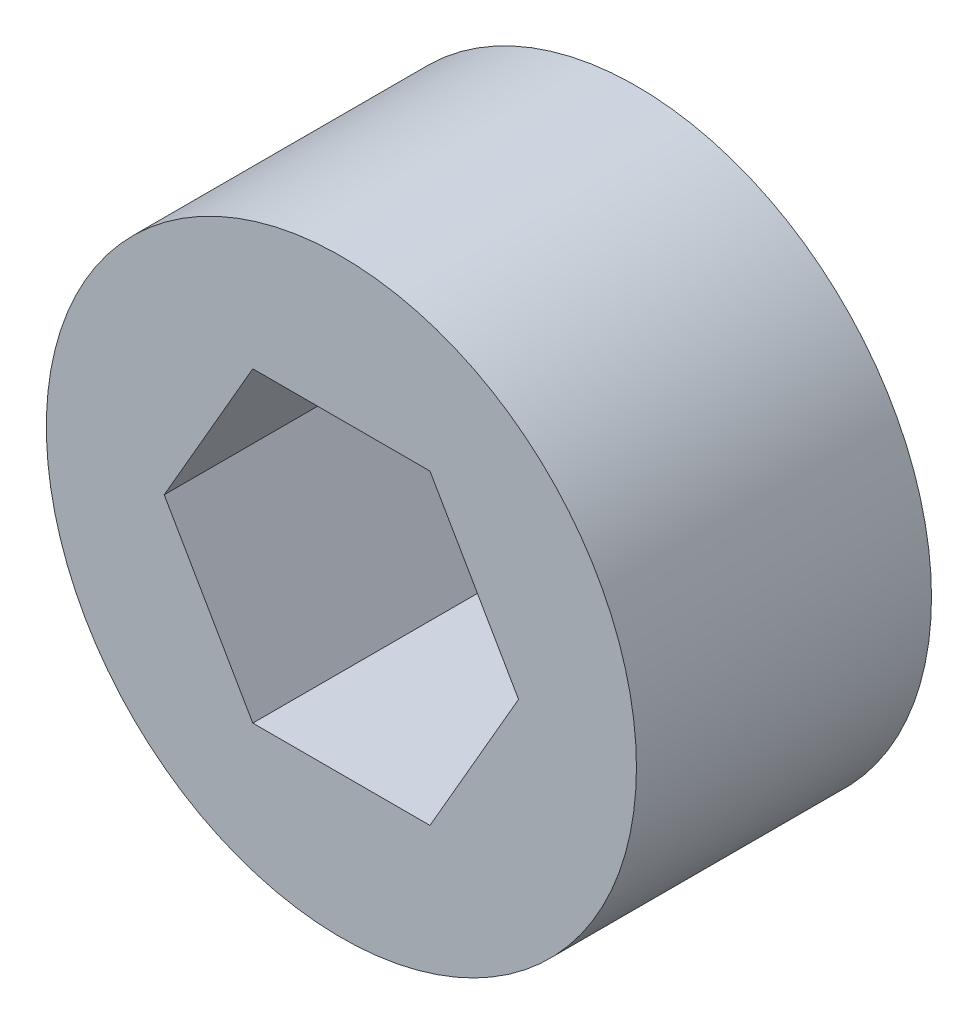
ISO-10303-21;
HEADER;
FILE_DESCRIPTION(('STEP AP214'),'2;1');
FILE_NAME('part.step','',(''),(''),'','','');
FILE_SCHEMA(('AUTOMOTIVE_DESIGN { 1 0 10303 214 1 1 1 1 }'));
ENDSEC;
DATA;
#1=APPLICATION_CONTEXT('core data for automotive mechanical design processes');
#2=APPLICATION_PROTOCOL_DEFINITION('international standard','automotive_design',2000,#1);
#3=PRODUCT_CONTEXT('',#1,'mechanical');
#4=PRODUCT('Part','Part','',(#3));
#5=PRODUCT_RELATED_PRODUCT_CATEGORY('part','',(#4));
#6=PRODUCT_DEFINITION_FORMATION('','',#4);
#7=PRODUCT_DEFINITION_CONTEXT('part definition',#1,'design');
#8=PRODUCT_DEFINITION('design','',#6,#7);
#9=PRODUCT_DEFINITION_SHAPE('','',#8);
#10=(LENGTH_UNIT() NAMED_UNIT(*) SI_UNIT(.MILLI.,.METRE.));
#11=(NAMED_UNIT(*) PLANE_ANGLE_UNIT() SI_UNIT($,.RADIAN.));
#12=(NAMED_UNIT(*) SI_UNIT($,.STERADIAN.) SOLID_ANGLE_UNIT());
#13=UNCERTAINTY_MEASURE_WITH_UNIT(LENGTH_MEASURE(1.E-05),#10,'distance_accuracy_value','');
#14=(GEOMETRIC_REPRESENTATION_CONTEXT(3) GLOBAL_UNCERTAINTY_ASSIGNED_CONTEXT((#13)) GLOBAL_UNIT_ASSIGNED_CONTEXT((#10,
#11,#12)) REPRESENTATION_CONTEXT('',''));
#15=CARTESIAN_POINT('',(0.,0.,0.));
#16=DIRECTION('',(0.,0.,1.));
#17=DIRECTION('',(1.,0.,0.));
#18=AXIS2_PLACEMENT_3D('',#15,#16,#17);
#19=CARTESIAN_POINT('',(0.,0.,12.7));
#20=DIRECTION('',(0.,0.,1.));
#21=DIRECTION('',(1.,0.,0.));
#22=AXIS2_PLACEMENT_3D('',#19,#20,#21);
#23=PLANE('',#22);
#24=CARTESIAN_POINT('',(0.,0.,12.7));
#25=DIRECTION('',(0.,0.,1.));
#26=DIRECTION('',(1.,0.,0.));
#27=AXIS2_PLACEMENT_3D('',#24,#25,#26);
#28=CIRCLE('',#27,12.7);
#29=CARTESIAN_POINT('',(12.7,0.,12.7));
#30=VERTEX_POINT('',#29);
#31=EDGE_CURVE('E11',#30,#30,#28,.T.);
#32=ORIENTED_EDGE('',*,*,#31,.T.);
#33=EDGE_LOOP('',(#32));
#34=FACE_BOUND('',#33,.T.);
#35=DIRECTION('',(0.5,0.866025403784438,0.));
#36=VECTOR('',#35,1.);
#37=CARTESIAN_POINT('',(3.81282117772829,-6.604,12.7));
#38=LINE('',#37,#36);
#39=CARTESIAN_POINT('',(3.81282117772829,-6.604,12.7));
#40=VERTEX_POINT('',#39);
#41=CARTESIAN_POINT('',(7.62564235545658,0.,12.7));
#42=VERTEX_POINT('',#41);
#43=EDGE_CURVE('E98',#40,#42,#38,.T.);
#44=ORIENTED_EDGE('',*,*,#43,.F.);
#45=DIRECTION('',(1.,0.,0.));
#46=VECTOR('',#45,1.);
#47=CARTESIAN_POINT('',(-3.81282117772829,-6.604,12.7));
#48=LINE('',#47,#46);
#49=CARTESIAN_POINT('',(-3.81282117772829,-6.604,12.7));
#50=VERTEX_POINT('',#49);
#51=EDGE_CURVE('E90',#50,#40,#48,.T.);
#52=ORIENTED_EDGE('',*,*,#51,.F.);
#53=DIRECTION('',(0.5,-0.866025403784439,0.));
#54=VECTOR('',#53,1.);
#55=CARTESIAN_POINT('',(-7.62564235545658,0.,12.7));
#56=LINE('',#55,#54);
#57=CARTESIAN_POINT('',(-7.62564235545658,0.,12.7));
#58=VERTEX_POINT('',#57);
#59=EDGE_CURVE('E118',#58,#50,#56,.T.);
#60=ORIENTED_EDGE('',*,*,#59,.F.);
#61=DIRECTION('',(-0.5,-0.866025403784438,0.));
#62=VECTOR('',#61,1.);
#63=CARTESIAN_POINT('',(-3.81282117772829,6.604,12.7));
#64=LINE('',#63,#62);
#65=CARTESIAN_POINT('',(-3.81282117772829,6.604,12.7));
#66=VERTEX_POINT('',#65);
#67=EDGE_CURVE('E116',#66,#58,#64,.T.);
#68=ORIENTED_EDGE('',*,*,#67,.F.);
#69=DIRECTION('',(-1.,0.,0.));
#70=VECTOR('',#69,1.);
#71=CARTESIAN_POINT('',(3.81282117772829,6.604,12.7));
#72=LINE('',#71,#70);
#73=CARTESIAN_POINT('',(3.81282117772829,6.604,12.7));
#74=VERTEX_POINT('',#73);
#75=EDGE_CURVE('E112',#74,#66,#72,.T.);
#76=ORIENTED_EDGE('',*,*,#75,.F.);
#77=DIRECTION('',(-0.5,0.866025403784439,0.));
#78=VECTOR('',#77,1.);
#79=CARTESIAN_POINT('',(7.62564235545658,0.,12.7));
#80=LINE('',#79,#78);
#81=EDGE_CURVE('E110',#42,#74,#80,.T.);
#82=ORIENTED_EDGE('',*,*,#81,.F.);
#83=EDGE_LOOP('',(#44,#52,#60,#68,#76,#82));
#84=FACE_BOUND('',#83,.T.);
#85=ADVANCED_FACE('F37',(#34,#84),#23,.T.);
#86=CARTESIAN_POINT('',(0.,0.,0.));
#87=DIRECTION('',(0.,0.,1.));
#88=DIRECTION('',(1.,0.,0.));
#89=AXIS2_PLACEMENT_3D('',#86,#87,#88);
#90=PLANE('',#89);
#91=CARTESIAN_POINT('',(0.,0.,0.));
#92=DIRECTION('',(0.,0.,1.));
#93=DIRECTION('',(1.,0.,0.));
#94=AXIS2_PLACEMENT_3D('',#91,#92,#93);
#95=CIRCLE('',#94,12.7);
#96=CARTESIAN_POINT('',(12.7,0.,0.));
#97=VERTEX_POINT('',#96);
#98=EDGE_CURVE('E41',#97,#97,#95,.T.);
#99=ORIENTED_EDGE('',*,*,#98,.F.);
#100=EDGE_LOOP('',(#99));
#101=FACE_BOUND('',#100,.T.);
#102=DIRECTION('',(1.,0.,0.));
#103=VECTOR('',#102,1.);
#104=CARTESIAN_POINT('',(-3.81282117772829,-6.604,0.));
#105=LINE('',#104,#103);
#106=CARTESIAN_POINT('',(-3.81282117772829,-6.604,0.));
#107=VERTEX_POINT('',#106);
#108=CARTESIAN_POINT('',(3.81282117772829,-6.604,0.));
#109=VERTEX_POINT('',#108);
#110=EDGE_CURVE('E60',#107,#109,#105,.T.);
#111=ORIENTED_EDGE('',*,*,#110,.T.);
#112=DIRECTION('',(0.5,0.866025403784438,0.));
#113=VECTOR('',#112,1.);
#114=CARTESIAN_POINT('',(3.81282117772829,-6.604,0.));
#115=LINE('',#114,#113);
#116=CARTESIAN_POINT('',(7.62564235545658,0.,0.));
#117=VERTEX_POINT('',#116);
#118=EDGE_CURVE('E105',#109,#117,#115,.T.);
#119=ORIENTED_EDGE('',*,*,#118,.T.);
#120=DIRECTION('',(-0.5,0.866025403784439,0.));
#121=VECTOR('',#120,1.);
#122=CARTESIAN_POINT('',(7.62564235545658,0.,0.));
#123=LINE('',#122,#121);
#124=CARTESIAN_POINT('',(3.81282117772829,6.604,0.));
#125=VERTEX_POINT('',#124);
#126=EDGE_CURVE('E122',#117,#125,#123,.T.);
#127=ORIENTED_EDGE('',*,*,#126,.T.);
#128=DIRECTION('',(-1.,0.,0.));
#129=VECTOR('',#128,1.);
#130=CARTESIAN_POINT('',(3.81282117772829,6.604,0.));
#131=LINE('',#130,#129);
#132=CARTESIAN_POINT('',(-3.81282117772829,6.604,0.));
#133=VERTEX_POINT('',#132);
#134=EDGE_CURVE('E125',#125,#133,#131,.T.);
#135=ORIENTED_EDGE('',*,*,#134,.T.);
#136=DIRECTION('',(-0.5,-0.866025403784438,0.));
#137=VECTOR('',#136,1.);
#138=CARTESIAN_POINT('',(-3.81282117772829,6.604,0.));
#139=LINE('',#138,#137);
#140=CARTESIAN_POINT('',(-7.62564235545658,0.,0.));
#141=VERTEX_POINT('',#140);
#142=EDGE_CURVE('E128',#133,#141,#139,.T.);
#143=ORIENTED_EDGE('',*,*,#142,.T.);
#144=DIRECTION('',(0.5,-0.866025403784439,0.));
#145=VECTOR('',#144,1.);
#146=CARTESIAN_POINT('',(-7.62564235545658,0.,0.));
#147=LINE('',#146,#145);
#148=EDGE_CURVE('E99',#141,#107,#147,.T.);
#149=ORIENTED_EDGE('',*,*,#148,.T.);
#150=EDGE_LOOP('',(#111,#119,#127,#135,#143,#149));
#151=FACE_BOUND('',#150,.T.);
#152=ADVANCED_FACE('F145',(#101,#151),#90,.F.);
#153=CARTESIAN_POINT('',(0.,0.,12.7));
#154=DIRECTION('',(0.,0.,-1.));
#155=DIRECTION('',(-1.,0.,0.));
#156=AXIS2_PLACEMENT_3D('',#153,#154,#155);
#157=CYLINDRICAL_SURFACE('',#156,12.7);
#158=ORIENTED_EDGE('',*,*,#31,.F.);
#159=EDGE_LOOP('',(#158));
#160=FACE_BOUND('',#159,.T.);
#161=ORIENTED_EDGE('',*,*,#98,.T.);
#162=EDGE_LOOP('',(#161));
#163=FACE_BOUND('',#162,.T.);
#164=ADVANCED_FACE('F39',(#160,#163),#157,.T.);
#165=CARTESIAN_POINT('',(-3.81282117772829,-6.604,12.7));
#166=DIRECTION('',(0.,1.,0.));
#167=DIRECTION('',(0.,0.,1.));
#168=AXIS2_PLACEMENT_3D('',#165,#166,#167);
#169=PLANE('',#168);
#170=ORIENTED_EDGE('',*,*,#110,.F.);
#171=DIRECTION('',(0.,0.,-1.));
#172=VECTOR('',#171,1.);
#173=CARTESIAN_POINT('',(-3.81282117772829,-6.604,12.7));
#174=LINE('',#173,#172);
#175=EDGE_CURVE('E94',#50,#107,#174,.T.);
#176=ORIENTED_EDGE('',*,*,#175,.F.);
#177=ORIENTED_EDGE('',*,*,#51,.T.);
#178=DIRECTION('',(0.,0.,-1.));
#179=VECTOR('',#178,1.);
#180=CARTESIAN_POINT('',(3.81282117772829,-6.604,12.7));
#181=LINE('',#180,#179);
#182=EDGE_CURVE('E93',#40,#109,#181,.T.);
#183=ORIENTED_EDGE('',*,*,#182,.T.);
#184=EDGE_LOOP('',(#170,#176,#177,#183));
#185=FACE_BOUND('',#184,.T.);
#186=ADVANCED_FACE('F92',(#185),#169,.T.);
#187=CARTESIAN_POINT('',(3.81282117772829,-6.604,12.7));
#188=DIRECTION('',(-0.866025403784438,0.5,0.));
#189=DIRECTION('',(-0.5,-0.866025403784439,0.));
#190=AXIS2_PLACEMENT_3D('',#187,#188,#189);
#191=PLANE('',#190);
#192=ORIENTED_EDGE('',*,*,#118,.F.);
#193=ORIENTED_EDGE('',*,*,#182,.F.);
#194=ORIENTED_EDGE('',*,*,#43,.T.);
#195=DIRECTION('',(0.,0.,-1.));
#196=VECTOR('',#195,1.);
#197=CARTESIAN_POINT('',(7.62564235545658,0.,12.7));
#198=LINE('',#197,#196);
#199=EDGE_CURVE('E106',#42,#117,#198,.T.);
#200=ORIENTED_EDGE('',*,*,#199,.T.);
#201=EDGE_LOOP('',(#192,#193,#194,#200));
#202=FACE_BOUND('',#201,.T.);
#203=ADVANCED_FACE('F102',(#202),#191,.T.);
#204=CARTESIAN_POINT('',(7.62564235545658,0.,12.7));
#205=DIRECTION('',(-0.866025403784439,-0.5,0.));
#206=DIRECTION('',(0.5,-0.866025403784439,0.));
#207=AXIS2_PLACEMENT_3D('',#204,#205,#206);
#208=PLANE('',#207);
#209=ORIENTED_EDGE('',*,*,#126,.F.);
#210=ORIENTED_EDGE('',*,*,#199,.F.);
#211=ORIENTED_EDGE('',*,*,#81,.T.);
#212=DIRECTION('',(0.,0.,-1.));
#213=VECTOR('',#212,1.);
#214=CARTESIAN_POINT('',(3.81282117772829,6.604,12.7));
#215=LINE('',#214,#213);
#216=EDGE_CURVE('E137',#74,#125,#215,.T.);
#217=ORIENTED_EDGE('',*,*,#216,.T.);
#218=EDGE_LOOP('',(#209,#210,#211,#217));
#219=FACE_BOUND('',#218,.T.);
#220=ADVANCED_FACE('F141',(#219),#208,.T.);
#221=CARTESIAN_POINT('',(3.81282117772829,6.604,12.7));
#222=DIRECTION('',(0.,-1.,0.));
#223=DIRECTION('',(1.,0.,0.));
#224=AXIS2_PLACEMENT_3D('',#221,#222,#223);
#225=PLANE('',#224);
#226=ORIENTED_EDGE('',*,*,#134,.F.);
#227=ORIENTED_EDGE('',*,*,#216,.F.);
#228=ORIENTED_EDGE('',*,*,#75,.T.);
#229=DIRECTION('',(0.,0.,-1.));
#230=VECTOR('',#229,1.);
#231=CARTESIAN_POINT('',(-3.81282117772829,6.604,12.7));
#232=LINE('',#231,#230);
#233=EDGE_CURVE('E135',#66,#133,#232,.T.);
#234=ORIENTED_EDGE('',*,*,#233,.T.);
#235=EDGE_LOOP('',(#226,#227,#228,#234));
#236=FACE_BOUND('',#235,.T.);
#237=ADVANCED_FACE('F153',(#236),#225,.T.);
#238=CARTESIAN_POINT('',(-3.81282117772829,6.604,12.7));
#239=DIRECTION('',(0.866025403784438,-0.5,0.));
#240=DIRECTION('',(0.5,0.866025403784439,0.));
#241=AXIS2_PLACEMENT_3D('',#238,#239,#240);
#242=PLANE('',#241);
#243=ORIENTED_EDGE('',*,*,#142,.F.);
#244=ORIENTED_EDGE('',*,*,#233,.F.);
#245=ORIENTED_EDGE('',*,*,#67,.T.);
#246=DIRECTION('',(0.,0.,-1.));
#247=VECTOR('',#246,1.);
#248=CARTESIAN_POINT('',(-7.62564235545658,0.,12.7));
#249=LINE('',#248,#247);
#250=EDGE_CURVE('E52',#58,#141,#249,.T.);
#251=ORIENTED_EDGE('',*,*,#250,.T.);
#252=EDGE_LOOP('',(#243,#244,#245,#251));
#253=FACE_BOUND('',#252,.T.);
#254=ADVANCED_FACE('F151',(#253),#242,.T.);
#255=CARTESIAN_POINT('',(-7.62564235545658,0.,12.7));
#256=DIRECTION('',(0.866025403784439,0.5,0.));
#257=DIRECTION('',(-0.5,0.866025403784439,0.));
#258=AXIS2_PLACEMENT_3D('',#255,#256,#257);
#259=PLANE('',#258);
#260=ORIENTED_EDGE('',*,*,#148,.F.);
#261=ORIENTED_EDGE('',*,*,#250,.F.);
#262=ORIENTED_EDGE('',*,*,#59,.T.);
#263=ORIENTED_EDGE('',*,*,#175,.T.);
#264=EDGE_LOOP('',(#260,#261,#262,#263));
#265=FACE_BOUND('',#264,.T.);
#266=ADVANCED_FACE('F147',(#265),#259,.T.);
#267=CLOSED_SHELL('',(#85,#152,#164,#186,#203,#220,#237,#254,#266));
#268=MANIFOLD_SOLID_BREP('B2',#267);
#269=ADVANCED_BREP_SHAPE_REPRESENTATION('',(#18,#268),#14);
#270=SHAPE_DEFINITION_REPRESENTATION(#9,#269);
ENDSEC;
END-ISO-10303-21;
